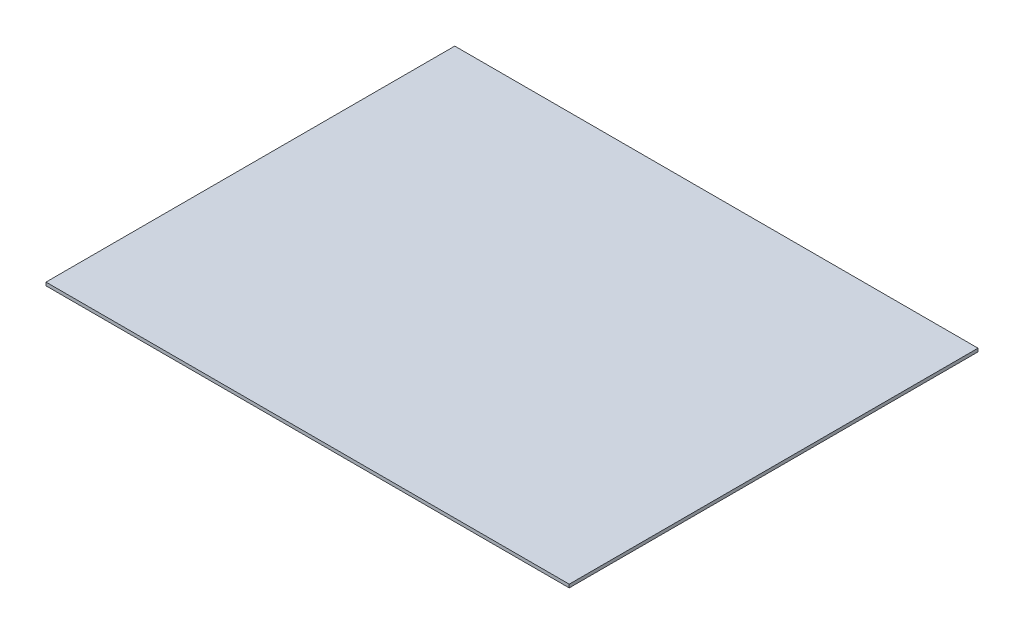
ISO-10303-21;
HEADER;
FILE_DESCRIPTION(('STEP AP214'),'2;1');
FILE_NAME('part.step','',(''),(''),'','','');
FILE_SCHEMA(('AUTOMOTIVE_DESIGN { 1 0 10303 214 1 1 1 1 }'));
ENDSEC;
DATA;
#1=APPLICATION_CONTEXT('core data for automotive mechanical design processes');
#2=APPLICATION_PROTOCOL_DEFINITION('international standard','automotive_design',2000,#1);
#3=PRODUCT_CONTEXT('',#1,'mechanical');
#4=PRODUCT('Part','Part','',(#3));
#5=PRODUCT_RELATED_PRODUCT_CATEGORY('part','',(#4));
#6=PRODUCT_DEFINITION_FORMATION('','',#4);
#7=PRODUCT_DEFINITION_CONTEXT('part definition',#1,'design');
#8=PRODUCT_DEFINITION('design','',#6,#7);
#9=PRODUCT_DEFINITION_SHAPE('','',#8);
#10=(LENGTH_UNIT() NAMED_UNIT(*) SI_UNIT(.MILLI.,.METRE.));
#11=(NAMED_UNIT(*) PLANE_ANGLE_UNIT() SI_UNIT($,.RADIAN.));
#12=(NAMED_UNIT(*) SI_UNIT($,.STERADIAN.) SOLID_ANGLE_UNIT());
#13=UNCERTAINTY_MEASURE_WITH_UNIT(LENGTH_MEASURE(1.E-05),#10,'distance_accuracy_value','');
#14=(GEOMETRIC_REPRESENTATION_CONTEXT(3) GLOBAL_UNCERTAINTY_ASSIGNED_CONTEXT((#13)) GLOBAL_UNIT_ASSIGNED_CONTEXT((#10,
#11,#12)) REPRESENTATION_CONTEXT('',''));
#15=CARTESIAN_POINT('',(0.,0.,0.));
#16=DIRECTION('',(0.,0.,1.));
#17=DIRECTION('',(1.,0.,0.));
#18=AXIS2_PLACEMENT_3D('',#15,#16,#17);
#19=CARTESIAN_POINT('',(-80.,1.,-62.5));
#20=DIRECTION('',(1.,0.,0.));
#21=DIRECTION('',(0.,0.,-1.));
#22=AXIS2_PLACEMENT_3D('',#19,#20,#21);
#23=PLANE('',#22);
#24=DIRECTION('',(0.,0.,1.));
#25=VECTOR('',#24,1.);
#26=CARTESIAN_POINT('',(-80.,0.,-62.5));
#27=LINE('',#26,#25);
#28=CARTESIAN_POINT('',(-80.,0.,-62.5));
#29=VERTEX_POINT('',#28);
#30=CARTESIAN_POINT('',(-80.,0.,62.5));
#31=VERTEX_POINT('',#30);
#32=EDGE_CURVE('E102',#29,#31,#27,.T.);
#33=ORIENTED_EDGE('',*,*,#32,.T.);
#34=DIRECTION('',(0.,-1.,0.));
#35=VECTOR('',#34,1.);
#36=CARTESIAN_POINT('',(-80.,1.,62.5));
#37=LINE('',#36,#35);
#38=CARTESIAN_POINT('',(-80.,1.,62.5));
#39=VERTEX_POINT('',#38);
#40=EDGE_CURVE('E11',#39,#31,#37,.T.);
#41=ORIENTED_EDGE('',*,*,#40,.F.);
#42=DIRECTION('',(0.,0.,1.));
#43=VECTOR('',#42,1.);
#44=CARTESIAN_POINT('',(-80.,1.,-62.5));
#45=LINE('',#44,#43);
#46=CARTESIAN_POINT('',(-80.,1.,-62.5));
#47=VERTEX_POINT('',#46);
#48=EDGE_CURVE('E90',#47,#39,#45,.T.);
#49=ORIENTED_EDGE('',*,*,#48,.F.);
#50=DIRECTION('',(0.,-1.,0.));
#51=VECTOR('',#50,1.);
#52=CARTESIAN_POINT('',(-80.,1.,-62.5));
#53=LINE('',#52,#51);
#54=EDGE_CURVE('E98',#47,#29,#53,.T.);
#55=ORIENTED_EDGE('',*,*,#54,.T.);
#56=EDGE_LOOP('',(#33,#41,#49,#55));
#57=FACE_BOUND('',#56,.T.);
#58=ADVANCED_FACE('F39',(#57),#23,.F.);
#59=CARTESIAN_POINT('',(-80.,1.,62.5));
#60=DIRECTION('',(0.,0.,-1.));
#61=DIRECTION('',(-1.,0.,0.));
#62=AXIS2_PLACEMENT_3D('',#59,#60,#61);
#63=PLANE('',#62);
#64=DIRECTION('',(1.,0.,0.));
#65=VECTOR('',#64,1.);
#66=CARTESIAN_POINT('',(-80.,0.,62.5));
#67=LINE('',#66,#65);
#68=CARTESIAN_POINT('',(80.,0.,62.5));
#69=VERTEX_POINT('',#68);
#70=EDGE_CURVE('E94',#31,#69,#67,.T.);
#71=ORIENTED_EDGE('',*,*,#70,.T.);
#72=DIRECTION('',(0.,-1.,0.));
#73=VECTOR('',#72,1.);
#74=CARTESIAN_POINT('',(80.,1.,62.5));
#75=LINE('',#74,#73);
#76=CARTESIAN_POINT('',(80.,1.,62.5));
#77=VERTEX_POINT('',#76);
#78=EDGE_CURVE('E47',#77,#69,#75,.T.);
#79=ORIENTED_EDGE('',*,*,#78,.F.);
#80=DIRECTION('',(1.,0.,0.));
#81=VECTOR('',#80,1.);
#82=CARTESIAN_POINT('',(-80.,1.,62.5));
#83=LINE('',#82,#81);
#84=EDGE_CURVE('E85',#39,#77,#83,.T.);
#85=ORIENTED_EDGE('',*,*,#84,.F.);
#86=ORIENTED_EDGE('',*,*,#40,.T.);
#87=EDGE_LOOP('',(#71,#79,#85,#86));
#88=FACE_BOUND('',#87,.T.);
#89=ADVANCED_FACE('F93',(#88),#63,.F.);
#90=CARTESIAN_POINT('',(80.,1.,-62.5));
#91=DIRECTION('',(-1.,0.,0.));
#92=DIRECTION('',(0.,0.,1.));
#93=AXIS2_PLACEMENT_3D('',#90,#91,#92);
#94=PLANE('',#93);
#95=DIRECTION('',(0.,0.,-1.));
#96=VECTOR('',#95,1.);
#97=CARTESIAN_POINT('',(80.,0.,-62.5));
#98=LINE('',#97,#96);
#99=CARTESIAN_POINT('',(80.,0.,-62.5));
#100=VERTEX_POINT('',#99);
#101=EDGE_CURVE('E72',#69,#100,#98,.T.);
#102=ORIENTED_EDGE('',*,*,#101,.T.);
#103=DIRECTION('',(0.,-1.,0.));
#104=VECTOR('',#103,1.);
#105=CARTESIAN_POINT('',(80.,1.,-62.5));
#106=LINE('',#105,#104);
#107=CARTESIAN_POINT('',(80.,1.,-62.5));
#108=VERTEX_POINT('',#107);
#109=EDGE_CURVE('E95',#108,#100,#106,.T.);
#110=ORIENTED_EDGE('',*,*,#109,.F.);
#111=DIRECTION('',(0.,0.,-1.));
#112=VECTOR('',#111,1.);
#113=CARTESIAN_POINT('',(80.,1.,-62.5));
#114=LINE('',#113,#112);
#115=EDGE_CURVE('E88',#77,#108,#114,.T.);
#116=ORIENTED_EDGE('',*,*,#115,.F.);
#117=ORIENTED_EDGE('',*,*,#78,.T.);
#118=EDGE_LOOP('',(#102,#110,#116,#117));
#119=FACE_BOUND('',#118,.T.);
#120=ADVANCED_FACE('F96',(#119),#94,.F.);
#121=CARTESIAN_POINT('',(-80.,1.,-62.5));
#122=DIRECTION('',(0.,0.,1.));
#123=DIRECTION('',(1.,0.,0.));
#124=AXIS2_PLACEMENT_3D('',#121,#122,#123);
#125=PLANE('',#124);
#126=DIRECTION('',(-1.,0.,0.));
#127=VECTOR('',#126,1.);
#128=CARTESIAN_POINT('',(-80.,0.,-62.5));
#129=LINE('',#128,#127);
#130=EDGE_CURVE('E78',#100,#29,#129,.T.);
#131=ORIENTED_EDGE('',*,*,#130,.T.);
#132=ORIENTED_EDGE('',*,*,#54,.F.);
#133=DIRECTION('',(-1.,0.,0.));
#134=VECTOR('',#133,1.);
#135=CARTESIAN_POINT('',(-80.,1.,-62.5));
#136=LINE('',#135,#134);
#137=EDGE_CURVE('E55',#108,#47,#136,.T.);
#138=ORIENTED_EDGE('',*,*,#137,.F.);
#139=ORIENTED_EDGE('',*,*,#109,.T.);
#140=EDGE_LOOP('',(#131,#132,#138,#139));
#141=FACE_BOUND('',#140,.T.);
#142=ADVANCED_FACE('F109',(#141),#125,.F.);
#143=CARTESIAN_POINT('',(0.,1.,0.));
#144=DIRECTION('',(0.,1.,0.));
#145=DIRECTION('',(0.,0.,1.));
#146=AXIS2_PLACEMENT_3D('',#143,#144,#145);
#147=PLANE('',#146);
#148=ORIENTED_EDGE('',*,*,#48,.T.);
#149=ORIENTED_EDGE('',*,*,#84,.T.);
#150=ORIENTED_EDGE('',*,*,#115,.T.);
#151=ORIENTED_EDGE('',*,*,#137,.T.);
#152=EDGE_LOOP('',(#148,#149,#150,#151));
#153=FACE_BOUND('',#152,.T.);
#154=ADVANCED_FACE('F86',(#153),#147,.T.);
#155=CARTESIAN_POINT('',(0.,0.,0.));
#156=DIRECTION('',(0.,1.,0.));
#157=DIRECTION('',(0.,0.,1.));
#158=AXIS2_PLACEMENT_3D('',#155,#156,#157);
#159=PLANE('',#158);
#160=ORIENTED_EDGE('',*,*,#32,.F.);
#161=ORIENTED_EDGE('',*,*,#130,.F.);
#162=ORIENTED_EDGE('',*,*,#101,.F.);
#163=ORIENTED_EDGE('',*,*,#70,.F.);
#164=EDGE_LOOP('',(#160,#161,#162,#163));
#165=FACE_BOUND('',#164,.T.);
#166=ADVANCED_FACE('F112',(#165),#159,.F.);
#167=CLOSED_SHELL('',(#58,#89,#120,#142,#154,#166));
#168=MANIFOLD_SOLID_BREP('B2',#167);
#169=ADVANCED_BREP_SHAPE_REPRESENTATION('',(#18,#168),#14);
#170=SHAPE_DEFINITION_REPRESENTATION(#9,#169);
ENDSEC;
END-ISO-10303-21;
